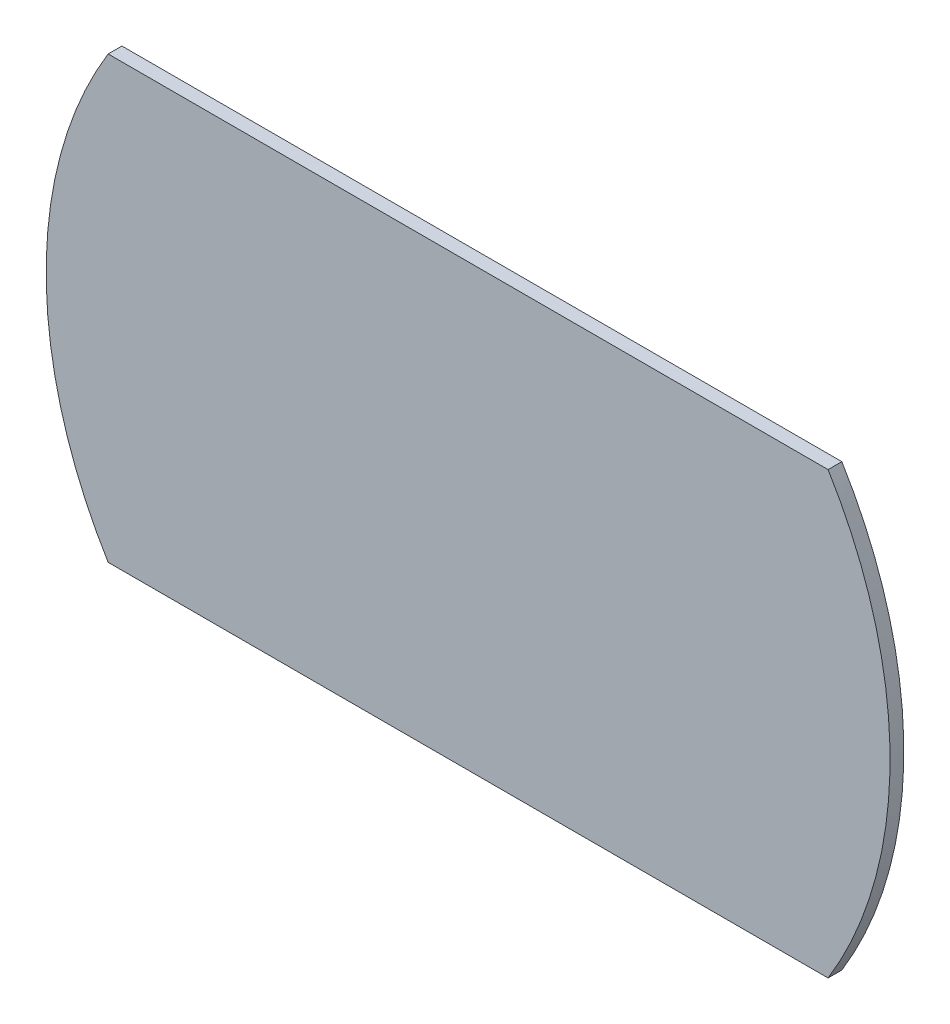
ISO-10303-21;
HEADER;
FILE_DESCRIPTION(('STEP AP214'),'2;1');
FILE_NAME('part.step','',(''),(''),'','','');
FILE_SCHEMA(('AUTOMOTIVE_DESIGN { 1 0 10303 214 1 1 1 1 }'));
ENDSEC;
DATA;
#1=APPLICATION_CONTEXT('core data for automotive mechanical design processes');
#2=APPLICATION_PROTOCOL_DEFINITION('international standard','automotive_design',2000,#1);
#3=PRODUCT_CONTEXT('',#1,'mechanical');
#4=PRODUCT('Part','Part','',(#3));
#5=PRODUCT_RELATED_PRODUCT_CATEGORY('part','',(#4));
#6=PRODUCT_DEFINITION_FORMATION('','',#4);
#7=PRODUCT_DEFINITION_CONTEXT('part definition',#1,'design');
#8=PRODUCT_DEFINITION('design','',#6,#7);
#9=PRODUCT_DEFINITION_SHAPE('','',#8);
#10=(LENGTH_UNIT() NAMED_UNIT(*) SI_UNIT(.MILLI.,.METRE.));
#11=(NAMED_UNIT(*) PLANE_ANGLE_UNIT() SI_UNIT($,.RADIAN.));
#12=(NAMED_UNIT(*) SI_UNIT($,.STERADIAN.) SOLID_ANGLE_UNIT());
#13=UNCERTAINTY_MEASURE_WITH_UNIT(LENGTH_MEASURE(1.E-05),#10,'distance_accuracy_value','');
#14=(GEOMETRIC_REPRESENTATION_CONTEXT(3) GLOBAL_UNCERTAINTY_ASSIGNED_CONTEXT((#13)) GLOBAL_UNIT_ASSIGNED_CONTEXT((#10,
#11,#12)) REPRESENTATION_CONTEXT('',''));
#15=CARTESIAN_POINT('',(0.,0.,0.));
#16=DIRECTION('',(0.,0.,1.));
#17=DIRECTION('',(1.,0.,0.));
#18=AXIS2_PLACEMENT_3D('',#15,#16,#17);
#19=CARTESIAN_POINT('',(0.,0.,19.05));
#20=DIRECTION('',(0.,0.,-1.));
#21=DIRECTION('',(-1.,0.,0.));
#22=AXIS2_PLACEMENT_3D('',#19,#20,#21);
#23=CYLINDRICAL_SURFACE('',#22,584.2);
#24=CARTESIAN_POINT('',(0.,0.,0.));
#25=DIRECTION('',(0.,0.,1.));
#26=DIRECTION('',(1.,0.,0.));
#27=AXIS2_PLACEMENT_3D('',#24,#25,#26);
#28=CIRCLE('',#27,584.2);
#29=CARTESIAN_POINT('',(-498.383988506854,304.8,0.));
#30=VERTEX_POINT('',#29);
#31=CARTESIAN_POINT('',(-498.383988506854,-304.8,0.));
#32=VERTEX_POINT('',#31);
#33=EDGE_CURVE('E107',#30,#32,#28,.T.);
#34=ORIENTED_EDGE('',*,*,#33,.T.);
#35=DIRECTION('',(0.,0.,-1.));
#36=VECTOR('',#35,1.);
#37=CARTESIAN_POINT('',(-498.383988506854,-304.8,19.05));
#38=LINE('',#37,#36);
#39=CARTESIAN_POINT('',(-498.383988506854,-304.8,19.05));
#40=VERTEX_POINT('',#39);
#41=EDGE_CURVE('E11',#40,#32,#38,.T.);
#42=ORIENTED_EDGE('',*,*,#41,.F.);
#43=CARTESIAN_POINT('',(0.,0.,19.05));
#44=DIRECTION('',(0.,0.,1.));
#45=DIRECTION('',(1.,0.,0.));
#46=AXIS2_PLACEMENT_3D('',#43,#44,#45);
#47=CIRCLE('',#46,584.2);
#48=CARTESIAN_POINT('',(-498.383988506854,304.8,19.05));
#49=VERTEX_POINT('',#48);
#50=EDGE_CURVE('E91',#49,#40,#47,.T.);
#51=ORIENTED_EDGE('',*,*,#50,.F.);
#52=DIRECTION('',(0.,0.,-1.));
#53=VECTOR('',#52,1.);
#54=CARTESIAN_POINT('',(-498.383988506854,304.8,19.05));
#55=LINE('',#54,#53);
#56=EDGE_CURVE('E103',#49,#30,#55,.T.);
#57=ORIENTED_EDGE('',*,*,#56,.T.);
#58=EDGE_LOOP('',(#34,#42,#51,#57));
#59=FACE_BOUND('',#58,.T.);
#60=ADVANCED_FACE('F39',(#59),#23,.T.);
#61=CARTESIAN_POINT('',(-498.383988506854,-304.8,19.05));
#62=DIRECTION('',(0.,1.,0.));
#63=DIRECTION('',(0.,0.,1.));
#64=AXIS2_PLACEMENT_3D('',#61,#62,#63);
#65=PLANE('',#64);
#66=DIRECTION('',(1.,0.,0.));
#67=VECTOR('',#66,1.);
#68=CARTESIAN_POINT('',(-498.383988506854,-304.8,0.));
#69=LINE('',#68,#67);
#70=CARTESIAN_POINT('',(498.383988506854,-304.8,0.));
#71=VERTEX_POINT('',#70);
#72=EDGE_CURVE('E96',#32,#71,#69,.T.);
#73=ORIENTED_EDGE('',*,*,#72,.T.);
#74=DIRECTION('',(0.,0.,-1.));
#75=VECTOR('',#74,1.);
#76=CARTESIAN_POINT('',(498.383988506854,-304.8,19.05));
#77=LINE('',#76,#75);
#78=CARTESIAN_POINT('',(498.383988506854,-304.8,19.05));
#79=VERTEX_POINT('',#78);
#80=EDGE_CURVE('E48',#79,#71,#77,.T.);
#81=ORIENTED_EDGE('',*,*,#80,.F.);
#82=DIRECTION('',(1.,0.,0.));
#83=VECTOR('',#82,1.);
#84=CARTESIAN_POINT('',(-498.383988506854,-304.8,19.05));
#85=LINE('',#84,#83);
#86=EDGE_CURVE('E86',#40,#79,#85,.T.);
#87=ORIENTED_EDGE('',*,*,#86,.F.);
#88=ORIENTED_EDGE('',*,*,#41,.T.);
#89=EDGE_LOOP('',(#73,#81,#87,#88));
#90=FACE_BOUND('',#89,.T.);
#91=ADVANCED_FACE('F95',(#90),#65,.F.);
#92=CARTESIAN_POINT('',(0.,0.,19.05));
#93=DIRECTION('',(0.,0.,-1.));
#94=DIRECTION('',(-1.,0.,0.));
#95=AXIS2_PLACEMENT_3D('',#92,#93,#94);
#96=CYLINDRICAL_SURFACE('',#95,584.2);
#97=CARTESIAN_POINT('',(0.,0.,0.));
#98=DIRECTION('',(0.,0.,1.));
#99=DIRECTION('',(1.,0.,0.));
#100=AXIS2_PLACEMENT_3D('',#97,#98,#99);
#101=CIRCLE('',#100,584.2);
#102=CARTESIAN_POINT('',(498.383988506854,304.8,0.));
#103=VERTEX_POINT('',#102);
#104=EDGE_CURVE('E73',#71,#103,#101,.T.);
#105=ORIENTED_EDGE('',*,*,#104,.T.);
#106=DIRECTION('',(0.,0.,-1.));
#107=VECTOR('',#106,1.);
#108=CARTESIAN_POINT('',(498.383988506854,304.8,19.05));
#109=LINE('',#108,#107);
#110=CARTESIAN_POINT('',(498.383988506854,304.8,19.05));
#111=VERTEX_POINT('',#110);
#112=EDGE_CURVE('E98',#111,#103,#109,.T.);
#113=ORIENTED_EDGE('',*,*,#112,.F.);
#114=CARTESIAN_POINT('',(0.,0.,19.05));
#115=DIRECTION('',(0.,0.,1.));
#116=DIRECTION('',(1.,0.,0.));
#117=AXIS2_PLACEMENT_3D('',#114,#115,#116);
#118=CIRCLE('',#117,584.2);
#119=EDGE_CURVE('E89',#79,#111,#118,.T.);
#120=ORIENTED_EDGE('',*,*,#119,.F.);
#121=ORIENTED_EDGE('',*,*,#80,.T.);
#122=EDGE_LOOP('',(#105,#113,#120,#121));
#123=FACE_BOUND('',#122,.T.);
#124=ADVANCED_FACE('F99',(#123),#96,.T.);
#125=CARTESIAN_POINT('',(-498.383988506854,304.8,19.05));
#126=DIRECTION('',(0.,-1.,0.));
#127=DIRECTION('',(0.,0.,-1.));
#128=AXIS2_PLACEMENT_3D('',#125,#126,#127);
#129=PLANE('',#128);
#130=DIRECTION('',(-1.,0.,0.));
#131=VECTOR('',#130,1.);
#132=CARTESIAN_POINT('',(-498.383988506854,304.8,0.));
#133=LINE('',#132,#131);
#134=EDGE_CURVE('E79',#103,#30,#133,.T.);
#135=ORIENTED_EDGE('',*,*,#134,.T.);
#136=ORIENTED_EDGE('',*,*,#56,.F.);
#137=DIRECTION('',(-1.,0.,0.));
#138=VECTOR('',#137,1.);
#139=CARTESIAN_POINT('',(-498.383988506854,304.8,19.05));
#140=LINE('',#139,#138);
#141=EDGE_CURVE('E56',#111,#49,#140,.T.);
#142=ORIENTED_EDGE('',*,*,#141,.F.);
#143=ORIENTED_EDGE('',*,*,#112,.T.);
#144=EDGE_LOOP('',(#135,#136,#142,#143));
#145=FACE_BOUND('',#144,.T.);
#146=ADVANCED_FACE('F120',(#145),#129,.F.);
#147=CARTESIAN_POINT('',(0.,0.,19.05));
#148=DIRECTION('',(0.,0.,1.));
#149=DIRECTION('',(1.,0.,0.));
#150=AXIS2_PLACEMENT_3D('',#147,#148,#149);
#151=PLANE('',#150);
#152=ORIENTED_EDGE('',*,*,#50,.T.);
#153=ORIENTED_EDGE('',*,*,#86,.T.);
#154=ORIENTED_EDGE('',*,*,#119,.T.);
#155=ORIENTED_EDGE('',*,*,#141,.T.);
#156=EDGE_LOOP('',(#152,#153,#154,#155));
#157=FACE_BOUND('',#156,.T.);
#158=ADVANCED_FACE('F87',(#157),#151,.T.);
#159=CARTESIAN_POINT('',(0.,0.,0.));
#160=DIRECTION('',(0.,0.,1.));
#161=DIRECTION('',(1.,0.,0.));
#162=AXIS2_PLACEMENT_3D('',#159,#160,#161);
#163=PLANE('',#162);
#164=ORIENTED_EDGE('',*,*,#33,.F.);
#165=ORIENTED_EDGE('',*,*,#134,.F.);
#166=ORIENTED_EDGE('',*,*,#104,.F.);
#167=ORIENTED_EDGE('',*,*,#72,.F.);
#168=EDGE_LOOP('',(#164,#165,#166,#167));
#169=FACE_BOUND('',#168,.T.);
#170=ADVANCED_FACE('F123',(#169),#163,.F.);
#171=CLOSED_SHELL('',(#60,#91,#124,#146,#158,#170));
#172=MANIFOLD_SOLID_BREP('B2',#171);
#173=ADVANCED_BREP_SHAPE_REPRESENTATION('',(#18,#172),#14);
#174=SHAPE_DEFINITION_REPRESENTATION(#9,#173);
ENDSEC;
END-ISO-10303-21;
